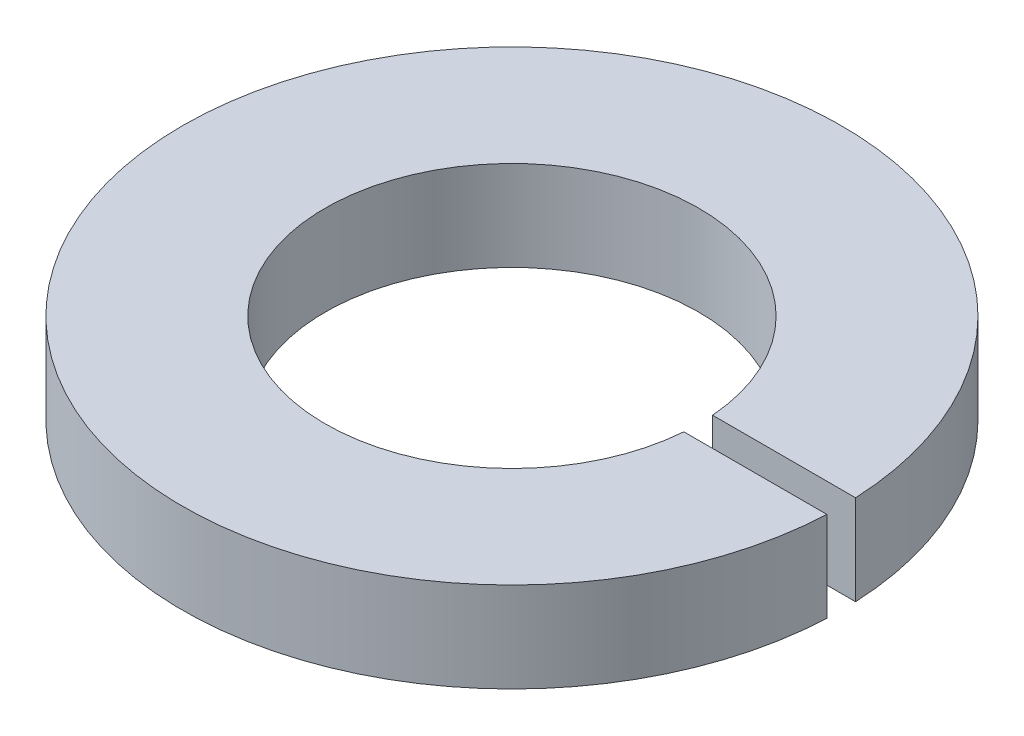
ISO-10303-21;
HEADER;
FILE_DESCRIPTION(('STEP AP214'),'2;1');
FILE_NAME('part.step','',(''),(''),'','','');
FILE_SCHEMA(('AUTOMOTIVE_DESIGN { 1 0 10303 214 1 1 1 1 }'));
ENDSEC;
DATA;
#1=APPLICATION_CONTEXT('core data for automotive mechanical design processes');
#2=APPLICATION_PROTOCOL_DEFINITION('international standard','automotive_design',2000,#1);
#3=PRODUCT_CONTEXT('',#1,'mechanical');
#4=PRODUCT('Part','Part','',(#3));
#5=PRODUCT_RELATED_PRODUCT_CATEGORY('part','',(#4));
#6=PRODUCT_DEFINITION_FORMATION('','',#4);
#7=PRODUCT_DEFINITION_CONTEXT('part definition',#1,'design');
#8=PRODUCT_DEFINITION('design','',#6,#7);
#9=PRODUCT_DEFINITION_SHAPE('','',#8);
#10=(LENGTH_UNIT() NAMED_UNIT(*) SI_UNIT(.MILLI.,.METRE.));
#11=(NAMED_UNIT(*) PLANE_ANGLE_UNIT() SI_UNIT($,.RADIAN.));
#12=(NAMED_UNIT(*) SI_UNIT($,.STERADIAN.) SOLID_ANGLE_UNIT());
#13=UNCERTAINTY_MEASURE_WITH_UNIT(LENGTH_MEASURE(1.E-05),#10,'distance_accuracy_value','');
#14=(GEOMETRIC_REPRESENTATION_CONTEXT(3) GLOBAL_UNCERTAINTY_ASSIGNED_CONTEXT((#13)) GLOBAL_UNIT_ASSIGNED_CONTEXT((#10,
#11,#12)) REPRESENTATION_CONTEXT('',''));
#15=CARTESIAN_POINT('',(0.,0.,0.));
#16=DIRECTION('',(0.,0.,1.));
#17=DIRECTION('',(1.,0.,0.));
#18=AXIS2_PLACEMENT_3D('',#15,#16,#17);
#19=CARTESIAN_POINT('',(0.,2.3876,0.));
#20=DIRECTION('',(0.,1.,0.));
#21=DIRECTION('',(0.,0.,1.));
#22=AXIS2_PLACEMENT_3D('',#19,#20,#21);
#23=PLANE('',#22);
#24=CARTESIAN_POINT('',(0.,2.3876,0.));
#25=DIRECTION('',(0.,1.,0.));
#26=DIRECTION('',(0.,0.,1.));
#27=AXIS2_PLACEMENT_3D('',#24,#25,#26);
#28=CIRCLE('',#27,8.7376);
#29=CARTESIAN_POINT('',(8.72928936168346,2.3876,-0.380999999999999));
#30=VERTEX_POINT('',#29);
#31=CARTESIAN_POINT('',(8.72928936168346,2.3876,0.381000000000001));
#32=VERTEX_POINT('',#31);
#33=EDGE_CURVE('E86',#30,#32,#28,.T.);
#34=ORIENTED_EDGE('',*,*,#33,.T.);
#35=DIRECTION('',(-1.,0.,0.));
#36=VECTOR('',#35,1.);
#37=CARTESIAN_POINT('',(8.72928936168346,2.3876,0.381000000000001));
#38=LINE('',#37,#36);
#39=CARTESIAN_POINT('',(4.93832441218679,2.3876,0.381000000000001));
#40=VERTEX_POINT('',#39);
#41=EDGE_CURVE('E99',#32,#40,#38,.T.);
#42=ORIENTED_EDGE('',*,*,#41,.T.);
#43=CARTESIAN_POINT('',(0.,2.3876,0.));
#44=DIRECTION('',(0.,1.,0.));
#45=DIRECTION('',(0.,0.,1.));
#46=AXIS2_PLACEMENT_3D('',#43,#44,#45);
#47=CIRCLE('',#46,4.953);
#48=CARTESIAN_POINT('',(4.93832441218679,2.3876,-0.381));
#49=VERTEX_POINT('',#48);
#50=EDGE_CURVE('E90',#49,#40,#47,.T.);
#51=ORIENTED_EDGE('',*,*,#50,.F.);
#52=DIRECTION('',(-1.,0.,0.));
#53=VECTOR('',#52,1.);
#54=CARTESIAN_POINT('',(8.72928936168346,2.3876,-0.380999999999999));
#55=LINE('',#54,#53);
#56=EDGE_CURVE('E54',#30,#49,#55,.T.);
#57=ORIENTED_EDGE('',*,*,#56,.F.);
#58=EDGE_LOOP('',(#34,#42,#51,#57));
#59=FACE_BOUND('',#58,.T.);
#60=ADVANCED_FACE('F32',(#59),#23,.T.);
#61=CARTESIAN_POINT('',(0.,0.,0.));
#62=DIRECTION('',(0.,1.,0.));
#63=DIRECTION('',(0.,0.,1.));
#64=AXIS2_PLACEMENT_3D('',#61,#62,#63);
#65=PLANE('',#64);
#66=DIRECTION('',(-1.,0.,0.));
#67=VECTOR('',#66,1.);
#68=CARTESIAN_POINT('',(8.72928936168346,0.,0.381000000000001));
#69=LINE('',#68,#67);
#70=CARTESIAN_POINT('',(8.72928936168346,0.,0.381000000000001));
#71=VERTEX_POINT('',#70);
#72=CARTESIAN_POINT('',(4.93832441218679,0.,0.381000000000001));
#73=VERTEX_POINT('',#72);
#74=EDGE_CURVE('E47',#71,#73,#69,.T.);
#75=ORIENTED_EDGE('',*,*,#74,.F.);
#76=CARTESIAN_POINT('',(0.,0.,0.));
#77=DIRECTION('',(0.,1.,0.));
#78=DIRECTION('',(0.,0.,1.));
#79=AXIS2_PLACEMENT_3D('',#76,#77,#78);
#80=CIRCLE('',#79,8.7376);
#81=CARTESIAN_POINT('',(8.72928936168346,0.,-0.380999999999999));
#82=VERTEX_POINT('',#81);
#83=EDGE_CURVE('E84',#82,#71,#80,.T.);
#84=ORIENTED_EDGE('',*,*,#83,.F.);
#85=DIRECTION('',(-1.,0.,0.));
#86=VECTOR('',#85,1.);
#87=CARTESIAN_POINT('',(8.72928936168346,0.,-0.380999999999999));
#88=LINE('',#87,#86);
#89=CARTESIAN_POINT('',(4.93832441218679,0.,-0.381));
#90=VERTEX_POINT('',#89);
#91=EDGE_CURVE('E70',#82,#90,#88,.T.);
#92=ORIENTED_EDGE('',*,*,#91,.T.);
#93=CARTESIAN_POINT('',(0.,0.,0.));
#94=DIRECTION('',(0.,1.,0.));
#95=DIRECTION('',(0.,0.,1.));
#96=AXIS2_PLACEMENT_3D('',#93,#94,#95);
#97=CIRCLE('',#96,4.953);
#98=EDGE_CURVE('E87',#90,#73,#97,.T.);
#99=ORIENTED_EDGE('',*,*,#98,.T.);
#100=EDGE_LOOP('',(#75,#84,#92,#99));
#101=FACE_BOUND('',#100,.T.);
#102=ADVANCED_FACE('F89',(#101),#65,.F.);
#103=CARTESIAN_POINT('',(0.,2.3876,0.));
#104=DIRECTION('',(0.,-1.,0.));
#105=DIRECTION('',(0.,0.,-1.));
#106=AXIS2_PLACEMENT_3D('',#103,#104,#105);
#107=CYLINDRICAL_SURFACE('',#106,8.7376);
#108=DIRECTION('',(0.,1.,0.));
#109=VECTOR('',#108,1.);
#110=CARTESIAN_POINT('',(8.72928936168346,0.,0.381000000000001));
#111=LINE('',#110,#109);
#112=EDGE_CURVE('E78',#71,#32,#111,.T.);
#113=ORIENTED_EDGE('',*,*,#112,.T.);
#114=ORIENTED_EDGE('',*,*,#33,.F.);
#115=DIRECTION('',(0.,1.,0.));
#116=VECTOR('',#115,1.);
#117=CARTESIAN_POINT('',(8.72928936168346,0.,-0.380999999999999));
#118=LINE('',#117,#116);
#119=EDGE_CURVE('E73',#82,#30,#118,.T.);
#120=ORIENTED_EDGE('',*,*,#119,.F.);
#121=ORIENTED_EDGE('',*,*,#83,.T.);
#122=EDGE_LOOP('',(#113,#114,#120,#121));
#123=FACE_BOUND('',#122,.T.);
#124=ADVANCED_FACE('F34',(#123),#107,.T.);
#125=CARTESIAN_POINT('',(0.,2.3876,0.));
#126=DIRECTION('',(0.,-1.,0.));
#127=DIRECTION('',(0.,0.,-1.));
#128=AXIS2_PLACEMENT_3D('',#125,#126,#127);
#129=CYLINDRICAL_SURFACE('',#128,4.953);
#130=ORIENTED_EDGE('',*,*,#50,.T.);
#131=DIRECTION('',(0.,-1.,0.));
#132=VECTOR('',#131,1.);
#133=CARTESIAN_POINT('',(4.93832441218679,2.3876,0.381000000000001));
#134=LINE('',#133,#132);
#135=EDGE_CURVE('E11',#40,#73,#134,.T.);
#136=ORIENTED_EDGE('',*,*,#135,.T.);
#137=ORIENTED_EDGE('',*,*,#98,.F.);
#138=DIRECTION('',(0.,-1.,0.));
#139=VECTOR('',#138,1.);
#140=CARTESIAN_POINT('',(4.93832441218679,2.3876,-0.381));
#141=LINE('',#140,#139);
#142=EDGE_CURVE('E40',#49,#90,#141,.T.);
#143=ORIENTED_EDGE('',*,*,#142,.F.);
#144=EDGE_LOOP('',(#130,#136,#137,#143));
#145=FACE_BOUND('',#144,.T.);
#146=ADVANCED_FACE('F105',(#145),#129,.F.);
#147=CARTESIAN_POINT('',(8.72928936168346,0.,-0.380999999999999));
#148=DIRECTION('',(0.,0.,-1.));
#149=DIRECTION('',(-1.,0.,0.));
#150=AXIS2_PLACEMENT_3D('',#147,#148,#149);
#151=PLANE('',#150);
#152=ORIENTED_EDGE('',*,*,#142,.T.);
#153=ORIENTED_EDGE('',*,*,#91,.F.);
#154=ORIENTED_EDGE('',*,*,#119,.T.);
#155=ORIENTED_EDGE('',*,*,#56,.T.);
#156=EDGE_LOOP('',(#152,#153,#154,#155));
#157=FACE_BOUND('',#156,.T.);
#158=ADVANCED_FACE('F72',(#157),#151,.F.);
#159=CARTESIAN_POINT('',(8.72928936168346,0.,0.381000000000001));
#160=DIRECTION('',(0.,0.,-1.));
#161=DIRECTION('',(-1.,0.,0.));
#162=AXIS2_PLACEMENT_3D('',#159,#160,#161);
#163=PLANE('',#162);
#164=ORIENTED_EDGE('',*,*,#41,.F.);
#165=ORIENTED_EDGE('',*,*,#112,.F.);
#166=ORIENTED_EDGE('',*,*,#74,.T.);
#167=ORIENTED_EDGE('',*,*,#135,.F.);
#168=EDGE_LOOP('',(#164,#165,#166,#167));
#169=FACE_BOUND('',#168,.T.);
#170=ADVANCED_FACE('F106',(#169),#163,.T.);
#171=CLOSED_SHELL('',(#60,#102,#124,#146,#158,#170));
#172=MANIFOLD_SOLID_BREP('B2',#171);
#173=ADVANCED_BREP_SHAPE_REPRESENTATION('',(#18,#172),#14);
#174=SHAPE_DEFINITION_REPRESENTATION(#9,#173);
ENDSEC;
END-ISO-10303-21;
